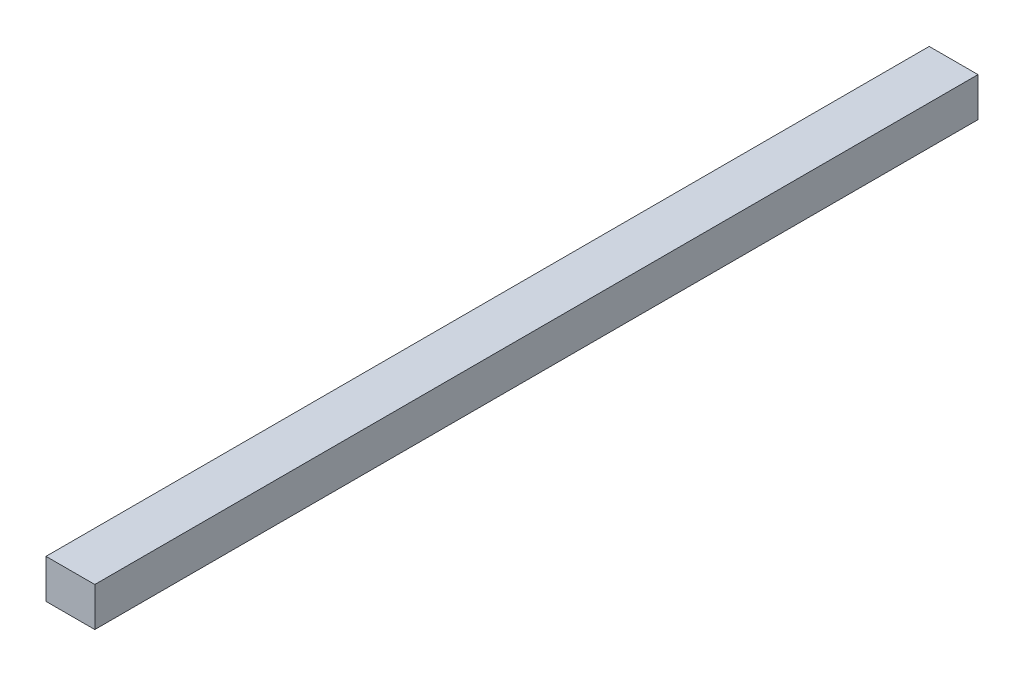
ISO-10303-21;
HEADER;
FILE_DESCRIPTION(('STEP AP214'),'2;1');
FILE_NAME('part.step','',(''),(''),'','','');
FILE_SCHEMA(('AUTOMOTIVE_DESIGN { 1 0 10303 214 1 1 1 1 }'));
ENDSEC;
DATA;
#1=APPLICATION_CONTEXT('core data for automotive mechanical design processes');
#2=APPLICATION_PROTOCOL_DEFINITION('international standard','automotive_design',2000,#1);
#3=PRODUCT_CONTEXT('',#1,'mechanical');
#4=PRODUCT('Part','Part','',(#3));
#5=PRODUCT_RELATED_PRODUCT_CATEGORY('part','',(#4));
#6=PRODUCT_DEFINITION_FORMATION('','',#4);
#7=PRODUCT_DEFINITION_CONTEXT('part definition',#1,'design');
#8=PRODUCT_DEFINITION('design','',#6,#7);
#9=PRODUCT_DEFINITION_SHAPE('','',#8);
#10=(LENGTH_UNIT() NAMED_UNIT(*) SI_UNIT(.MILLI.,.METRE.));
#11=(NAMED_UNIT(*) PLANE_ANGLE_UNIT() SI_UNIT($,.RADIAN.));
#12=(NAMED_UNIT(*) SI_UNIT($,.STERADIAN.) SOLID_ANGLE_UNIT());
#13=UNCERTAINTY_MEASURE_WITH_UNIT(LENGTH_MEASURE(1.E-05),#10,'distance_accuracy_value','');
#14=(GEOMETRIC_REPRESENTATION_CONTEXT(3) GLOBAL_UNCERTAINTY_ASSIGNED_CONTEXT((#13)) GLOBAL_UNIT_ASSIGNED_CONTEXT((#10,
#11,#12)) REPRESENTATION_CONTEXT('',''));
#15=CARTESIAN_POINT('',(0.,0.,0.));
#16=DIRECTION('',(0.,0.,1.));
#17=DIRECTION('',(1.,0.,0.));
#18=AXIS2_PLACEMENT_3D('',#15,#16,#17);
#19=CARTESIAN_POINT('',(0.,0.,905.));
#20=DIRECTION('',(1.,0.,0.));
#21=DIRECTION('',(0.,0.,-1.));
#22=AXIS2_PLACEMENT_3D('',#19,#20,#21);
#23=PLANE('',#22);
#24=DIRECTION('',(0.,-1.,0.));
#25=VECTOR('',#24,1.);
#26=CARTESIAN_POINT('',(0.,0.,0.));
#27=LINE('',#26,#25);
#28=CARTESIAN_POINT('',(0.,40.,0.));
#29=VERTEX_POINT('',#28);
#30=CARTESIAN_POINT('',(0.,0.,0.));
#31=VERTEX_POINT('',#30);
#32=EDGE_CURVE('E95',#29,#31,#27,.T.);
#33=ORIENTED_EDGE('',*,*,#32,.T.);
#34=DIRECTION('',(0.,0.,-1.));
#35=VECTOR('',#34,1.);
#36=CARTESIAN_POINT('',(0.,0.,905.));
#37=LINE('',#36,#35);
#38=CARTESIAN_POINT('',(0.,0.,905.));
#39=VERTEX_POINT('',#38);
#40=EDGE_CURVE('E11',#39,#31,#37,.T.);
#41=ORIENTED_EDGE('',*,*,#40,.F.);
#42=DIRECTION('',(0.,-1.,0.));
#43=VECTOR('',#42,1.);
#44=CARTESIAN_POINT('',(0.,0.,905.));
#45=LINE('',#44,#43);
#46=CARTESIAN_POINT('',(0.,40.,905.));
#47=VERTEX_POINT('',#46);
#48=EDGE_CURVE('E83',#47,#39,#45,.T.);
#49=ORIENTED_EDGE('',*,*,#48,.F.);
#50=DIRECTION('',(0.,0.,-1.));
#51=VECTOR('',#50,1.);
#52=CARTESIAN_POINT('',(0.,40.,905.));
#53=LINE('',#52,#51);
#54=EDGE_CURVE('E91',#47,#29,#53,.T.);
#55=ORIENTED_EDGE('',*,*,#54,.T.);
#56=EDGE_LOOP('',(#33,#41,#49,#55));
#57=FACE_BOUND('',#56,.T.);
#58=ADVANCED_FACE('F32',(#57),#23,.F.);
#59=CARTESIAN_POINT('',(0.,0.,905.));
#60=DIRECTION('',(0.,1.,0.));
#61=DIRECTION('',(0.,0.,1.));
#62=AXIS2_PLACEMENT_3D('',#59,#60,#61);
#63=PLANE('',#62);
#64=DIRECTION('',(1.,0.,0.));
#65=VECTOR('',#64,1.);
#66=CARTESIAN_POINT('',(0.,0.,0.));
#67=LINE('',#66,#65);
#68=CARTESIAN_POINT('',(50.,0.,0.));
#69=VERTEX_POINT('',#68);
#70=EDGE_CURVE('E87',#31,#69,#67,.T.);
#71=ORIENTED_EDGE('',*,*,#70,.T.);
#72=DIRECTION('',(0.,0.,-1.));
#73=VECTOR('',#72,1.);
#74=CARTESIAN_POINT('',(50.,0.,905.));
#75=LINE('',#74,#73);
#76=CARTESIAN_POINT('',(50.,0.,905.));
#77=VERTEX_POINT('',#76);
#78=EDGE_CURVE('E40',#77,#69,#75,.T.);
#79=ORIENTED_EDGE('',*,*,#78,.F.);
#80=DIRECTION('',(1.,0.,0.));
#81=VECTOR('',#80,1.);
#82=CARTESIAN_POINT('',(0.,0.,905.));
#83=LINE('',#82,#81);
#84=EDGE_CURVE('E78',#39,#77,#83,.T.);
#85=ORIENTED_EDGE('',*,*,#84,.F.);
#86=ORIENTED_EDGE('',*,*,#40,.T.);
#87=EDGE_LOOP('',(#71,#79,#85,#86));
#88=FACE_BOUND('',#87,.T.);
#89=ADVANCED_FACE('F86',(#88),#63,.F.);
#90=CARTESIAN_POINT('',(50.,0.,905.));
#91=DIRECTION('',(-1.,0.,0.));
#92=DIRECTION('',(0.,0.,1.));
#93=AXIS2_PLACEMENT_3D('',#90,#91,#92);
#94=PLANE('',#93);
#95=DIRECTION('',(0.,1.,0.));
#96=VECTOR('',#95,1.);
#97=CARTESIAN_POINT('',(50.,0.,0.));
#98=LINE('',#97,#96);
#99=CARTESIAN_POINT('',(50.,40.,0.));
#100=VERTEX_POINT('',#99);
#101=EDGE_CURVE('E65',#69,#100,#98,.T.);
#102=ORIENTED_EDGE('',*,*,#101,.T.);
#103=DIRECTION('',(0.,0.,-1.));
#104=VECTOR('',#103,1.);
#105=CARTESIAN_POINT('',(50.,40.,905.));
#106=LINE('',#105,#104);
#107=CARTESIAN_POINT('',(50.,40.,905.));
#108=VERTEX_POINT('',#107);
#109=EDGE_CURVE('E88',#108,#100,#106,.T.);
#110=ORIENTED_EDGE('',*,*,#109,.F.);
#111=DIRECTION('',(0.,1.,0.));
#112=VECTOR('',#111,1.);
#113=CARTESIAN_POINT('',(50.,0.,905.));
#114=LINE('',#113,#112);
#115=EDGE_CURVE('E81',#77,#108,#114,.T.);
#116=ORIENTED_EDGE('',*,*,#115,.F.);
#117=ORIENTED_EDGE('',*,*,#78,.T.);
#118=EDGE_LOOP('',(#102,#110,#116,#117));
#119=FACE_BOUND('',#118,.T.);
#120=ADVANCED_FACE('F89',(#119),#94,.F.);
#121=CARTESIAN_POINT('',(0.,40.,905.));
#122=DIRECTION('',(0.,-1.,0.));
#123=DIRECTION('',(0.,0.,-1.));
#124=AXIS2_PLACEMENT_3D('',#121,#122,#123);
#125=PLANE('',#124);
#126=DIRECTION('',(-1.,0.,0.));
#127=VECTOR('',#126,1.);
#128=CARTESIAN_POINT('',(0.,40.,0.));
#129=LINE('',#128,#127);
#130=EDGE_CURVE('E71',#100,#29,#129,.T.);
#131=ORIENTED_EDGE('',*,*,#130,.T.);
#132=ORIENTED_EDGE('',*,*,#54,.F.);
#133=DIRECTION('',(-1.,0.,0.));
#134=VECTOR('',#133,1.);
#135=CARTESIAN_POINT('',(0.,40.,905.));
#136=LINE('',#135,#134);
#137=EDGE_CURVE('E48',#108,#47,#136,.T.);
#138=ORIENTED_EDGE('',*,*,#137,.F.);
#139=ORIENTED_EDGE('',*,*,#109,.T.);
#140=EDGE_LOOP('',(#131,#132,#138,#139));
#141=FACE_BOUND('',#140,.T.);
#142=ADVANCED_FACE('F102',(#141),#125,.F.);
#143=CARTESIAN_POINT('',(0.,0.,905.));
#144=DIRECTION('',(0.,0.,-1.));
#145=DIRECTION('',(-1.,0.,0.));
#146=AXIS2_PLACEMENT_3D('',#143,#144,#145);
#147=PLANE('',#146);
#148=ORIENTED_EDGE('',*,*,#48,.T.);
#149=ORIENTED_EDGE('',*,*,#84,.T.);
#150=ORIENTED_EDGE('',*,*,#115,.T.);
#151=ORIENTED_EDGE('',*,*,#137,.T.);
#152=EDGE_LOOP('',(#148,#149,#150,#151));
#153=FACE_BOUND('',#152,.T.);
#154=ADVANCED_FACE('F79',(#153),#147,.F.);
#155=CARTESIAN_POINT('',(0.,0.,0.));
#156=DIRECTION('',(0.,0.,-1.));
#157=DIRECTION('',(-1.,0.,0.));
#158=AXIS2_PLACEMENT_3D('',#155,#156,#157);
#159=PLANE('',#158);
#160=ORIENTED_EDGE('',*,*,#32,.F.);
#161=ORIENTED_EDGE('',*,*,#130,.F.);
#162=ORIENTED_EDGE('',*,*,#101,.F.);
#163=ORIENTED_EDGE('',*,*,#70,.F.);
#164=EDGE_LOOP('',(#160,#161,#162,#163));
#165=FACE_BOUND('',#164,.T.);
#166=ADVANCED_FACE('F105',(#165),#159,.T.);
#167=CLOSED_SHELL('',(#58,#89,#120,#142,#154,#166));
#168=MANIFOLD_SOLID_BREP('B2',#167);
#169=ADVANCED_BREP_SHAPE_REPRESENTATION('',(#18,#168),#14);
#170=SHAPE_DEFINITION_REPRESENTATION(#9,#169);
ENDSEC;
END-ISO-10303-21;
